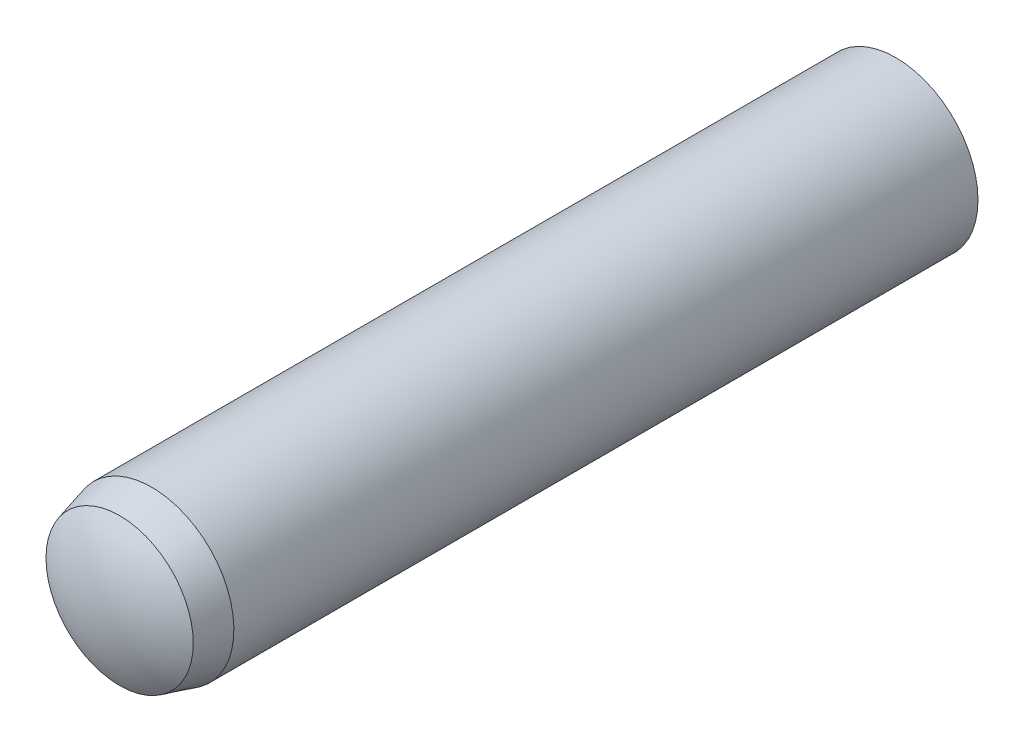
ISO-10303-21;
HEADER;
FILE_DESCRIPTION(('STEP AP214'),'2;1');
FILE_NAME('part.step','',(''),(''),'','','');
FILE_SCHEMA(('AUTOMOTIVE_DESIGN { 1 0 10303 214 1 1 1 1 }'));
ENDSEC;
DATA;
#1=APPLICATION_CONTEXT('core data for automotive mechanical design processes');
#2=APPLICATION_PROTOCOL_DEFINITION('international standard','automotive_design',2000,#1);
#3=PRODUCT_CONTEXT('',#1,'mechanical');
#4=PRODUCT('Part','Part','',(#3));
#5=PRODUCT_RELATED_PRODUCT_CATEGORY('part','',(#4));
#6=PRODUCT_DEFINITION_FORMATION('','',#4);
#7=PRODUCT_DEFINITION_CONTEXT('part definition',#1,'design');
#8=PRODUCT_DEFINITION('design','',#6,#7);
#9=PRODUCT_DEFINITION_SHAPE('','',#8);
#10=(LENGTH_UNIT() NAMED_UNIT(*) SI_UNIT(.MILLI.,.METRE.));
#11=(NAMED_UNIT(*) PLANE_ANGLE_UNIT() SI_UNIT($,.RADIAN.));
#12=(NAMED_UNIT(*) SI_UNIT($,.STERADIAN.) SOLID_ANGLE_UNIT());
#13=UNCERTAINTY_MEASURE_WITH_UNIT(LENGTH_MEASURE(1.E-05),#10,'distance_accuracy_value','');
#14=(GEOMETRIC_REPRESENTATION_CONTEXT(3) GLOBAL_UNCERTAINTY_ASSIGNED_CONTEXT((#13)) GLOBAL_UNIT_ASSIGNED_CONTEXT((#10,
#11,#12)) REPRESENTATION_CONTEXT('',''));
#15=CARTESIAN_POINT('',(0.,0.,0.));
#16=DIRECTION('',(0.,0.,1.));
#17=DIRECTION('',(1.,0.,0.));
#18=AXIS2_PLACEMENT_3D('',#15,#16,#17);
#19=CARTESIAN_POINT('',(0.,0.,-15.9166666666667));
#20=DIRECTION('',(0.,0.,1.));
#21=DIRECTION('',(0.,1.,0.));
#22=AXIS2_PLACEMENT_3D('',#19,#20,#21);
#23=SPHERICAL_SURFACE('',#22,9.08333333333331);
#24=CARTESIAN_POINT('',(0.,0.,-23.5));
#25=DIRECTION('',(0.,0.,1.));
#26=DIRECTION('',(0.,-1.,0.));
#27=AXIS2_PLACEMENT_3D('',#24,#25,#26);
#28=CIRCLE('',#27,4.99999999999999);
#29=CARTESIAN_POINT('',(0.,-4.99999999999999,-23.5));
#30=VERTEX_POINT('',#29);
#31=EDGE_CURVE('E10',#30,#30,#28,.T.);
#32=ORIENTED_EDGE('',*,*,#31,.F.);
#33=EDGE_LOOP('',(#32));
#34=FACE_BOUND('',#33,.T.);
#35=ADVANCED_FACE('F32',(#34),#23,.T.);
#36=CARTESIAN_POINT('',(0.,0.,25.));
#37=DIRECTION('',(0.,0.,1.));
#38=DIRECTION('',(0.,-1.,0.));
#39=AXIS2_PLACEMENT_3D('',#36,#37,#38);
#40=CYLINDRICAL_SURFACE('',#39,5.);
#41=CARTESIAN_POINT('',(0.,0.,21.75));
#42=DIRECTION('',(0.,0.,1.));
#43=DIRECTION('',(0.,-1.,0.));
#44=AXIS2_PLACEMENT_3D('',#41,#42,#43);
#45=CIRCLE('',#44,5.);
#46=CARTESIAN_POINT('',(0.,-5.,21.75));
#47=VERTEX_POINT('',#46);
#48=EDGE_CURVE('E38',#47,#47,#45,.T.);
#49=ORIENTED_EDGE('',*,*,#48,.F.);
#50=EDGE_LOOP('',(#49));
#51=FACE_BOUND('',#50,.T.);
#52=ORIENTED_EDGE('',*,*,#31,.T.);
#53=EDGE_LOOP('',(#52));
#54=FACE_BOUND('',#53,.T.);
#55=ADVANCED_FACE('F53',(#51,#54),#40,.T.);
#56=CARTESIAN_POINT('',(0.,0.,21.75));
#57=DIRECTION('',(0.,0.,-1.));
#58=DIRECTION('',(0.,1.,0.));
#59=AXIS2_PLACEMENT_3D('',#56,#57,#58);
#60=CONICAL_SURFACE('',#59,5.,0.261799387799148);
#61=CARTESIAN_POINT('',(0.,0.,23.7));
#62=DIRECTION('',(0.,0.,1.));
#63=DIRECTION('',(0.,-1.,0.));
#64=AXIS2_PLACEMENT_3D('',#61,#62,#63);
#65=CIRCLE('',#64,4.47749907475931);
#66=CARTESIAN_POINT('',(0.,-4.47749907475931,23.7));
#67=VERTEX_POINT('',#66);
#68=EDGE_CURVE('E42',#67,#67,#65,.T.);
#69=ORIENTED_EDGE('',*,*,#68,.F.);
#70=EDGE_LOOP('',(#69));
#71=FACE_BOUND('',#70,.T.);
#72=ORIENTED_EDGE('',*,*,#48,.T.);
#73=EDGE_LOOP('',(#72));
#74=FACE_BOUND('',#73,.T.);
#75=ADVANCED_FACE('F51',(#71,#74),#60,.T.);
#76=CARTESIAN_POINT('',(0.,0.,16.6392315521267));
#77=DIRECTION('',(0.,0.,1.));
#78=DIRECTION('',(0.,1.,0.));
#79=AXIS2_PLACEMENT_3D('',#76,#77,#78);
#80=SPHERICAL_SURFACE('',#79,8.36076844787329);
#81=ORIENTED_EDGE('',*,*,#68,.T.);
#82=EDGE_LOOP('',(#81));
#83=FACE_BOUND('',#82,.T.);
#84=ADVANCED_FACE('F49',(#83),#80,.T.);
#85=CLOSED_SHELL('',(#35,#55,#75,#84));
#86=MANIFOLD_SOLID_BREP('B2',#85);
#87=ADVANCED_BREP_SHAPE_REPRESENTATION('',(#18,#86),#14);
#88=SHAPE_DEFINITION_REPRESENTATION(#9,#87);
ENDSEC;
END-ISO-10303-21;
